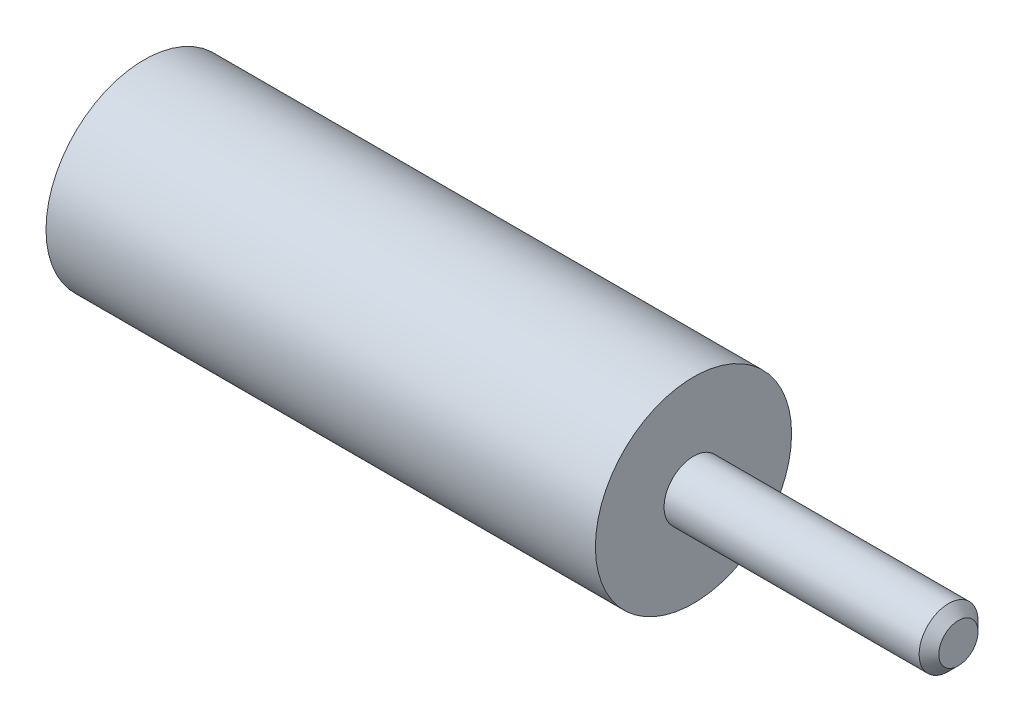
ISO-10303-21;
HEADER;
FILE_DESCRIPTION(('STEP AP214'),'2;1');
FILE_NAME('part.step','',(''),(''),'','','');
FILE_SCHEMA(('AUTOMOTIVE_DESIGN { 1 0 10303 214 1 1 1 1 }'));
ENDSEC;
DATA;
#1=APPLICATION_CONTEXT('core data for automotive mechanical design processes');
#2=APPLICATION_PROTOCOL_DEFINITION('international standard','automotive_design',2000,#1);
#3=PRODUCT_CONTEXT('',#1,'mechanical');
#4=PRODUCT('Part','Part','',(#3));
#5=PRODUCT_RELATED_PRODUCT_CATEGORY('part','',(#4));
#6=PRODUCT_DEFINITION_FORMATION('','',#4);
#7=PRODUCT_DEFINITION_CONTEXT('part definition',#1,'design');
#8=PRODUCT_DEFINITION('design','',#6,#7);
#9=PRODUCT_DEFINITION_SHAPE('','',#8);
#10=(LENGTH_UNIT() NAMED_UNIT(*) SI_UNIT(.MILLI.,.METRE.));
#11=(NAMED_UNIT(*) PLANE_ANGLE_UNIT() SI_UNIT($,.RADIAN.));
#12=(NAMED_UNIT(*) SI_UNIT($,.STERADIAN.) SOLID_ANGLE_UNIT());
#13=UNCERTAINTY_MEASURE_WITH_UNIT(LENGTH_MEASURE(1.E-05),#10,'distance_accuracy_value','');
#14=(GEOMETRIC_REPRESENTATION_CONTEXT(3) GLOBAL_UNCERTAINTY_ASSIGNED_CONTEXT((#13)) GLOBAL_UNIT_ASSIGNED_CONTEXT((#10,
#11,#12)) REPRESENTATION_CONTEXT('',''));
#15=CARTESIAN_POINT('',(0.,0.,0.));
#16=DIRECTION('',(0.,0.,1.));
#17=DIRECTION('',(1.,0.,0.));
#18=AXIS2_PLACEMENT_3D('',#15,#16,#17);
#19=CARTESIAN_POINT('',(27.,-2.,-2.));
#20=DIRECTION('',(1.,0.,0.));
#21=DIRECTION('',(0.,1.,0.));
#22=AXIS2_PLACEMENT_3D('',#19,#20,#21);
#23=PLANE('',#22);
#24=CARTESIAN_POINT('',(27.,0.,0.));
#25=DIRECTION('',(-1.,0.,0.));
#26=DIRECTION('',(0.,0.,1.));
#27=AXIS2_PLACEMENT_3D('',#24,#25,#26);
#28=CIRCLE('',#27,2.);
#29=CARTESIAN_POINT('',(27.,0.,2.));
#30=VERTEX_POINT('',#29);
#31=EDGE_CURVE('E41',#30,#30,#28,.F.);
#32=ORIENTED_EDGE('',*,*,#31,.T.);
#33=EDGE_LOOP('',(#32));
#34=FACE_BOUND('',#33,.T.);
#35=ADVANCED_FACE('F15',(#34),#23,.T.);
#36=CARTESIAN_POINT('',(-56.,10.,-10.));
#37=DIRECTION('',(-1.,0.,0.));
#38=DIRECTION('',(0.,-1.,0.));
#39=AXIS2_PLACEMENT_3D('',#36,#37,#38);
#40=PLANE('',#39);
#41=CARTESIAN_POINT('',(-56.,0.,0.));
#42=DIRECTION('',(1.,0.,0.));
#43=DIRECTION('',(0.,0.,-1.));
#44=AXIS2_PLACEMENT_3D('',#41,#42,#43);
#45=CIRCLE('',#44,10.);
#46=CARTESIAN_POINT('',(-56.,0.,-10.));
#47=VERTEX_POINT('',#46);
#48=EDGE_CURVE('E38',#47,#47,#45,.F.);
#49=ORIENTED_EDGE('',*,*,#48,.T.);
#50=EDGE_LOOP('',(#49));
#51=FACE_BOUND('',#50,.T.);
#52=ADVANCED_FACE('F50',(#51),#40,.T.);
#53=CARTESIAN_POINT('',(26.,0.,0.));
#54=DIRECTION('',(-1.,0.,0.));
#55=DIRECTION('',(0.,0.,1.));
#56=AXIS2_PLACEMENT_3D('',#53,#54,#55);
#57=CONICAL_SURFACE('',#56,3.,0.78539816339745);
#58=CARTESIAN_POINT('',(26.,0.,0.));
#59=DIRECTION('',(1.,0.,0.));
#60=DIRECTION('',(0.,1.,0.));
#61=AXIS2_PLACEMENT_3D('',#58,#59,#60);
#62=CIRCLE('',#61,3.);
#63=CARTESIAN_POINT('',(26.,3.,0.));
#64=VERTEX_POINT('',#63);
#65=EDGE_CURVE('E28',#64,#64,#62,.T.);
#66=ORIENTED_EDGE('',*,*,#65,.T.);
#67=EDGE_LOOP('',(#66));
#68=FACE_BOUND('',#67,.T.);
#69=ORIENTED_EDGE('',*,*,#31,.F.);
#70=EDGE_LOOP('',(#69));
#71=FACE_BOUND('',#70,.T.);
#72=ADVANCED_FACE('F47',(#68,#71),#57,.T.);
#73=CARTESIAN_POINT('',(-56.,0.,0.));
#74=DIRECTION('',(1.,0.,0.));
#75=DIRECTION('',(0.,0.,-1.));
#76=AXIS2_PLACEMENT_3D('',#73,#74,#75);
#77=CYLINDRICAL_SURFACE('',#76,10.);
#78=ORIENTED_EDGE('',*,*,#48,.F.);
#79=EDGE_LOOP('',(#78));
#80=FACE_BOUND('',#79,.T.);
#81=CARTESIAN_POINT('',(0.,0.,0.));
#82=DIRECTION('',(1.,0.,0.));
#83=DIRECTION('',(0.,0.,-1.));
#84=AXIS2_PLACEMENT_3D('',#81,#82,#83);
#85=CIRCLE('',#84,10.);
#86=CARTESIAN_POINT('',(0.,0.,-10.));
#87=VERTEX_POINT('',#86);
#88=EDGE_CURVE('E23',#87,#87,#85,.T.);
#89=ORIENTED_EDGE('',*,*,#88,.F.);
#90=EDGE_LOOP('',(#89));
#91=FACE_BOUND('',#90,.T.);
#92=ADVANCED_FACE('F49',(#80,#91),#77,.T.);
#93=CARTESIAN_POINT('',(0.,0.,0.));
#94=DIRECTION('',(1.,0.,0.));
#95=DIRECTION('',(0.,0.,-1.));
#96=AXIS2_PLACEMENT_3D('',#93,#94,#95);
#97=CYLINDRICAL_SURFACE('',#96,3.);
#98=CARTESIAN_POINT('',(0.,0.,0.));
#99=DIRECTION('',(1.,0.,0.));
#100=DIRECTION('',(0.,0.,-1.));
#101=AXIS2_PLACEMENT_3D('',#98,#99,#100);
#102=CIRCLE('',#101,3.);
#103=CARTESIAN_POINT('',(0.,0.,-3.));
#104=VERTEX_POINT('',#103);
#105=EDGE_CURVE('E10',#104,#104,#102,.F.);
#106=ORIENTED_EDGE('',*,*,#105,.F.);
#107=EDGE_LOOP('',(#106));
#108=FACE_BOUND('',#107,.T.);
#109=ORIENTED_EDGE('',*,*,#65,.F.);
#110=EDGE_LOOP('',(#109));
#111=FACE_BOUND('',#110,.T.);
#112=ADVANCED_FACE('F58',(#108,#111),#97,.T.);
#113=CARTESIAN_POINT('',(0.,-10.,-10.));
#114=DIRECTION('',(1.,0.,0.));
#115=DIRECTION('',(0.,1.,0.));
#116=AXIS2_PLACEMENT_3D('',#113,#114,#115);
#117=PLANE('',#116);
#118=ORIENTED_EDGE('',*,*,#105,.T.);
#119=EDGE_LOOP('',(#118));
#120=FACE_BOUND('',#119,.T.);
#121=ORIENTED_EDGE('',*,*,#88,.T.);
#122=EDGE_LOOP('',(#121));
#123=FACE_BOUND('',#122,.T.);
#124=ADVANCED_FACE('F17',(#120,#123),#117,.T.);
#125=CLOSED_SHELL('',(#35,#52,#72,#92,#112,#124));
#126=MANIFOLD_SOLID_BREP('B1',#125);
#127=ADVANCED_BREP_SHAPE_REPRESENTATION('',(#18,#126),#14);
#128=SHAPE_DEFINITION_REPRESENTATION(#9,#127);
ENDSEC;
END-ISO-10303-21;
